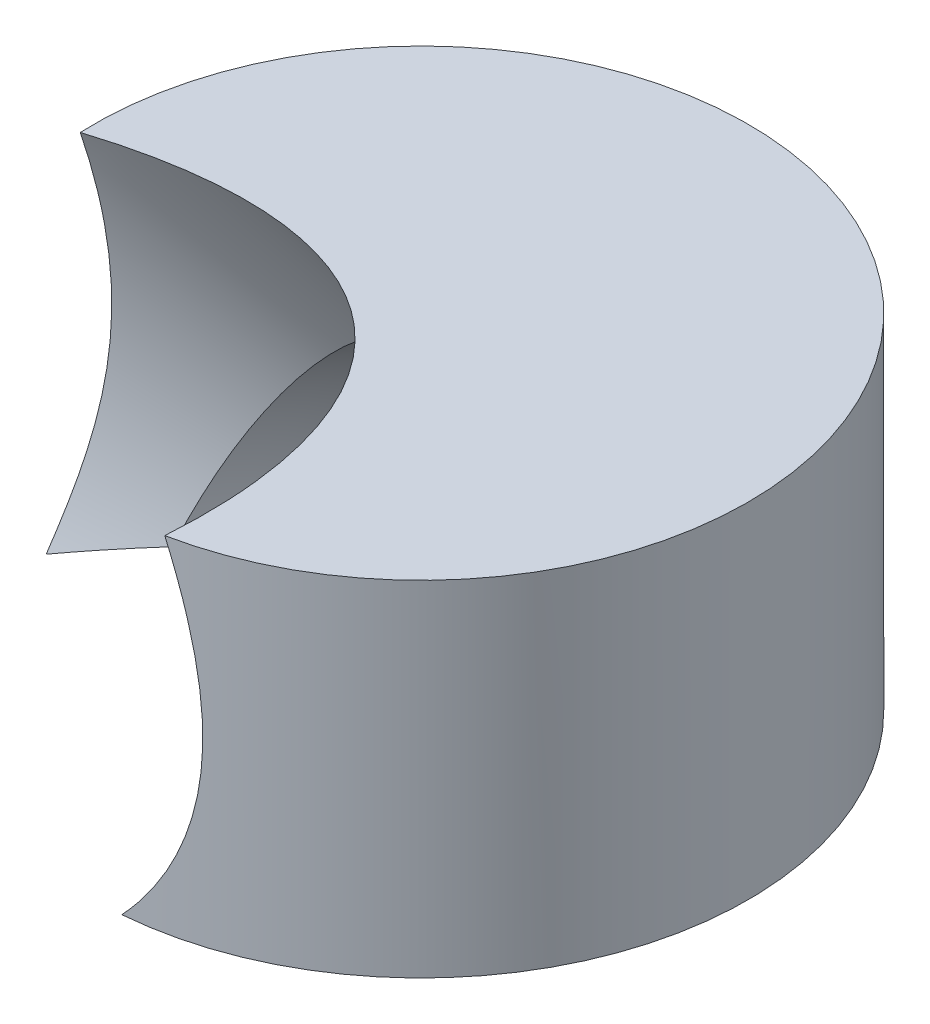
ISO-10303-21;
HEADER;
FILE_DESCRIPTION(('STEP AP214'),'2;1');
FILE_NAME('part.step','',(''),(''),'','','');
FILE_SCHEMA(('AUTOMOTIVE_DESIGN { 1 0 10303 214 1 1 1 1 }'));
ENDSEC;
DATA;
#1=APPLICATION_CONTEXT('core data for automotive mechanical design processes');
#2=APPLICATION_PROTOCOL_DEFINITION('international standard','automotive_design',2000,#1);
#3=PRODUCT_CONTEXT('',#1,'mechanical');
#4=PRODUCT('Part','Part','',(#3));
#5=PRODUCT_RELATED_PRODUCT_CATEGORY('part','',(#4));
#6=PRODUCT_DEFINITION_FORMATION('','',#4);
#7=PRODUCT_DEFINITION_CONTEXT('part definition',#1,'design');
#8=PRODUCT_DEFINITION('design','',#6,#7);
#9=PRODUCT_DEFINITION_SHAPE('','',#8);
#10=(LENGTH_UNIT() NAMED_UNIT(*) SI_UNIT(.MILLI.,.METRE.));
#11=(NAMED_UNIT(*) PLANE_ANGLE_UNIT() SI_UNIT($,.RADIAN.));
#12=(NAMED_UNIT(*) SI_UNIT($,.STERADIAN.) SOLID_ANGLE_UNIT());
#13=UNCERTAINTY_MEASURE_WITH_UNIT(LENGTH_MEASURE(1.E-05),#10,'distance_accuracy_value','');
#14=(GEOMETRIC_REPRESENTATION_CONTEXT(3) GLOBAL_UNCERTAINTY_ASSIGNED_CONTEXT((#13)) GLOBAL_UNIT_ASSIGNED_CONTEXT((#10,
#11,#12)) REPRESENTATION_CONTEXT('',''));
#15=CARTESIAN_POINT('',(0.,0.,0.));
#16=DIRECTION('',(0.,0.,1.));
#17=DIRECTION('',(1.,0.,0.));
#18=AXIS2_PLACEMENT_3D('',#15,#16,#17);
#19=CARTESIAN_POINT('',(-30.3108891324554,-97.7,-15.));
#20=DIRECTION('',(0.,1.,0.));
#21=DIRECTION('',(0.,0.,1.));
#22=AXIS2_PLACEMENT_3D('',#19,#20,#21);
#23=CYLINDRICAL_SURFACE('',#22,3.8);
#24=CARTESIAN_POINT('',(-30.3108891324554,-97.,-15.));
#25=DIRECTION('',(0.,-1.,0.));
#26=DIRECTION('',(0.,0.,-1.));
#27=AXIS2_PLACEMENT_3D('',#24,#25,#26);
#28=CIRCLE('',#27,3.8);
#29=CARTESIAN_POINT('',(-34.1074748867385,-97.,-14.8389515278731));
#30=VERTEX_POINT('',#29);
#31=CARTESIAN_POINT('',(-29.5615041608978,-97.,-11.2746245606109));
#32=VERTEX_POINT('',#31);
#33=EDGE_CURVE('E47',#30,#32,#28,.T.);
#34=ORIENTED_EDGE('',*,*,#33,.T.);
#35=CARTESIAN_POINT('',(-29.5615718217302,-96.9998,-11.2746109508069));
#36=CARTESIAN_POINT('',(-29.53763803957,-97.0705546747354,-11.2794247462016));
#37=CARTESIAN_POINT('',(-29.5146500801677,-97.1416227927385,-11.2842887533409));
#38=CARTESIAN_POINT('',(-29.4706900194513,-97.2843968994103,-11.2939816546816));
#39=CARTESIAN_POINT('',(-29.4497183150889,-97.3561030106608,-11.2988105417965));
#40=CARTESIAN_POINT('',(-29.3898726378823,-97.5727136817751,-11.3130751591436));
#41=CARTESIAN_POINT('',(-29.3542565706601,-97.7185595063866,-11.3222492231308));
#42=CARTESIAN_POINT('',(-29.2925498799048,-98.0158920594205,-11.3388484808279));
#43=CARTESIAN_POINT('',(-29.2666970753927,-98.1674313864205,-11.3462286182644));
#44=CARTESIAN_POINT('',(-29.2281326277631,-98.4721704684842,-11.3574647994605));
#45=CARTESIAN_POINT('',(-29.2153985650956,-98.6253669371334,-11.361326854209));
#46=CARTESIAN_POINT('',(-29.2081906977153,-98.8659999089151,-11.3635109048227));
#47=CARTESIAN_POINT('',(-29.2082058948879,-98.9532633070037,-11.3635051651497));
#48=CARTESIAN_POINT('',(-29.2141562776908,-99.1275942839115,-11.3617048818101));
#49=CARTESIAN_POINT('',(-29.2200916228646,-99.21466185739,-11.3599102899354));
#50=CARTESIAN_POINT('',(-29.2384728837583,-99.3874862827804,-11.3544527278158));
#51=CARTESIAN_POINT('',(-29.25087590459,-99.473247984399,-11.350802071296));
#52=CARTESIAN_POINT('',(-29.28271386022,-99.6433678720104,-11.341703913024));
#53=CARTESIAN_POINT('',(-29.3021482085004,-99.7277261744541,-11.3362565611463));
#54=CARTESIAN_POINT('',(-29.3486730087821,-99.8952399752276,-11.3237619418322));
#55=CARTESIAN_POINT('',(-29.3758484243732,-99.9783707074235,-11.3166971003957));
#56=CARTESIAN_POINT('',(-29.4378599705625,-100.141642311545,-11.30150885241));
#57=CARTESIAN_POINT('',(-29.4726971532893,-100.22178277107,-11.2933853005391));
#58=CARTESIAN_POINT('',(-29.5498590103042,-100.378437216735,-11.276776971286));
#59=CARTESIAN_POINT('',(-29.5921916387963,-100.454947239775,-11.268291817506));
#60=CARTESIAN_POINT('',(-29.6838301804554,-100.603678553575,-11.2518058035735));
#61=CARTESIAN_POINT('',(-29.7331327845388,-100.675901856539,-11.2438047161636));
#62=CARTESIAN_POINT('',(-29.8188734097495,-100.790159616009,-11.2318373349568));
#63=CARTESIAN_POINT('',(-29.8534280990566,-100.83358075225,-11.2274651122902));
#64=CARTESIAN_POINT('',(-29.9247889301809,-100.918387540099,-11.2194954705612));
#65=CARTESIAN_POINT('',(-29.9615881491862,-100.959778804244,-11.2158958098834));
#66=CARTESIAN_POINT('',(-29.999468369808,-101.0002,-11.2127824054338));
#67=B_SPLINE_CURVE_WITH_KNOTS('',3,(#35,#36,#37,#38,#39,#40,#41,#42,#43,#44,#45,#46,#47,#48,#49,
#50,#51,#52,#53,#54,#55,#56,#57,#58,#59,#60,#61,#62,#63,#64,#65,#66),.UNSPECIFIED.,.F.,.F.,(4,2,
2,2,2,2,2,2,2,2,2,2,2,2,2,4),(0.,0.224529608607515,0.449103331512431,0.899999438099035,
1.36126182999433,1.82173462355426,2.08334352968175,2.34495948616094,2.60486201655758,
2.86474287218575,3.12759392537997,3.39048109634734,3.65364893503421,3.91669224847533,
4.08360469898824,4.25002609611653),.UNSPECIFIED.);
#68=CARTESIAN_POINT('',(-29.9992809717437,-101.,-11.2127978197385));
#69=VERTEX_POINT('',#68);
#70=EDGE_CURVE('E65',#32,#69,#67,.T.);
#71=ORIENTED_EDGE('',*,*,#70,.T.);
#72=CARTESIAN_POINT('',(-30.3108891324554,-101.,-15.));
#73=DIRECTION('',(0.,-1.,0.));
#74=DIRECTION('',(0.,0.,-1.));
#75=AXIS2_PLACEMENT_3D('',#72,#73,#74);
#76=CIRCLE('',#75,3.8);
#77=CARTESIAN_POINT('',(-34.0630722359518,-101.,-14.3990657624698));
#78=VERTEX_POINT('',#77);
#79=EDGE_CURVE('E85',#78,#69,#76,.T.);
#80=ORIENTED_EDGE('',*,*,#79,.F.);
#81=CARTESIAN_POINT('',(-34.0630424960343,-101.0002,-14.3988800983306));
#82=CARTESIAN_POINT('',(-34.0718110950236,-100.941314470494,-14.4535727451348));
#83=CARTESIAN_POINT('',(-34.0790221760432,-100.880334472737,-14.5062811678693));
#84=CARTESIAN_POINT('',(-34.0908557219644,-100.754374278326,-14.6070441904282));
#85=CARTESIAN_POINT('',(-34.0954772635486,-100.689392664025,-14.655097125263));
#86=CARTESIAN_POINT('',(-34.1026321593722,-100.556042110918,-14.7455647480082));
#87=CARTESIAN_POINT('',(-34.1051772884519,-100.487694636403,-14.7880100685159));
#88=CARTESIAN_POINT('',(-34.1087664887118,-100.347645833791,-14.8669930394829));
#89=CARTESIAN_POINT('',(-34.1098108736453,-100.275945209957,-14.9035319233538));
#90=CARTESIAN_POINT('',(-34.1109217529916,-100.129422236479,-14.970402087824));
#91=CARTESIAN_POINT('',(-34.1109851278273,-100.054590686642,-15.0007132631708));
#92=CARTESIAN_POINT('',(-34.1105903971042,-99.9025749564758,-15.0547990580072));
#93=CARTESIAN_POINT('',(-34.1101320842451,-99.8253898527917,-15.0785710744027));
#94=CARTESIAN_POINT('',(-34.1090618616021,-99.6693551529714,-15.1196080622126));
#95=CARTESIAN_POINT('',(-34.1084500210118,-99.5905063212864,-15.1368759562337));
#96=CARTESIAN_POINT('',(-34.1073225352008,-99.4316928256814,-15.1652013652592));
#97=CARTESIAN_POINT('',(-34.1068069187919,-99.3517278352348,-15.1762570221539));
#98=CARTESIAN_POINT('',(-34.105844151858,-99.1563821489884,-15.1961271026659));
#99=CARTESIAN_POINT('',(-34.105523751255,-99.0406874090679,-15.2018883521968));
#100=CARTESIAN_POINT('',(-34.1054574020448,-98.8092431130936,-15.2030801746675));
#101=CARTESIAN_POINT('',(-34.1057117891474,-98.6934935645024,-15.1985047103584));
#102=CARTESIAN_POINT('',(-34.1066077120446,-98.4621048722978,-15.180551636075));
#103=CARTESIAN_POINT('',(-34.1072512583088,-98.3464694469417,-15.1671282836051));
#104=CARTESIAN_POINT('',(-34.1086049493334,-98.1163673648676,-15.1328387347087));
#105=CARTESIAN_POINT('',(-34.109315079109,-98.001900451573,-15.1119742099853));
#106=CARTESIAN_POINT('',(-34.1106104820581,-97.7367003729433,-15.0560139292456));
#107=CARTESIAN_POINT('',(-34.1110770227965,-97.5864778116717,-15.0184938633948));
#108=CARTESIAN_POINT('',(-34.1106868548476,-97.3639688517672,-14.9556101110743));
#109=CARTESIAN_POINT('',(-34.1103798808479,-97.2906762454686,-14.9336903207714));
#110=CARTESIAN_POINT('',(-34.1093014387462,-97.14474722216,-14.8877902799355));
#111=CARTESIAN_POINT('',(-34.1085300015538,-97.0721107618106,-14.8638101666064));
#112=CARTESIAN_POINT('',(-34.1074719611309,-96.9998,-14.8388825738608));
#113=B_SPLINE_CURVE_WITH_KNOTS('',3,(#81,#82,#83,#84,#85,#86,#87,#88,#89,#90,#91,#92,#93,#94,
#95,#96,#97,#98,#99,#100,#101,#102,#103,#104,#105,#106,#107,#108,#109,#110,#111,#112),
.UNSPECIFIED.,.F.,.F.,(4,2,2,2,2,2,2,2,2,2,2,2,2,2,2,4),(0.,0.242487812446074,0.485062030598367,
0.726250914982039,0.967389367841488,1.20929447541561,1.45129574114893,1.69318813428323,
1.93515284012405,2.28209096716264,2.62923177885386,2.97818149210641,3.32705286107753,
3.79116730720975,4.020646080706,4.25010958426821),.UNSPECIFIED.);
#114=EDGE_CURVE('E100',#78,#30,#113,.T.);
#115=ORIENTED_EDGE('',*,*,#114,.T.);
#116=EDGE_LOOP('',(#34,#71,#80,#115));
#117=FACE_BOUND('',#116,.T.);
#118=ADVANCED_FACE('F41',(#117),#23,.T.);
#119=CARTESIAN_POINT('',(-30.3108891324554,-97.,-15.));
#120=DIRECTION('',(0.,-1.,0.));
#121=DIRECTION('',(0.,0.,-1.));
#122=AXIS2_PLACEMENT_3D('',#119,#120,#121);
#123=PLANE('',#122);
#124=ORIENTED_EDGE('',*,*,#33,.F.);
#125=CARTESIAN_POINT('',(-37.139132571092,-97.,-6.29120446410718));
#126=DIRECTION('',(0.,-1.,0.));
#127=DIRECTION('',(-0.617017715423195,0.,0.786949260660394));
#128=AXIS2_PLACEMENT_3D('',#125,#126,#127);
#129=ELLIPSE('',#128,10.5033012386468,5.02786274995613);
#130=EDGE_CURVE('E84',#30,#32,#129,.T.);
#131=ORIENTED_EDGE('',*,*,#130,.T.);
#132=EDGE_LOOP('',(#124,#131));
#133=FACE_BOUND('',#132,.T.);
#134=ADVANCED_FACE('F108',(#133),#123,.F.);
#135=CARTESIAN_POINT('',(-30.3108891324554,-101.,-15.));
#136=DIRECTION('',(0.,-1.,0.));
#137=DIRECTION('',(0.,0.,-1.));
#138=AXIS2_PLACEMENT_3D('',#135,#136,#137);
#139=PLANE('',#138);
#140=CARTESIAN_POINT('',(-31.835817099933,-101.,-13.0550948431946));
#141=DIRECTION('',(0.,-1.,0.));
#142=DIRECTION('',(-0.617017715423195,0.,0.786949260660394));
#143=AXIS2_PLACEMENT_3D('',#140,#141,#142);
#144=ELLIPSE('',#143,5.40311255334571,2.58643522865266);
#145=CARTESIAN_POINT('',(-33.4038431098608,-101.,-15.2088915834869));
#146=VERTEX_POINT('',#145);
#147=EDGE_CURVE('E57',#78,#146,#144,.T.);
#148=ORIENTED_EDGE('',*,*,#147,.F.);
#149=ORIENTED_EDGE('',*,*,#79,.T.);
#150=CARTESIAN_POINT('',(-29.3701180218789,-101.,-12.0461974139248));
#151=VERTEX_POINT('',#150);
#152=EDGE_CURVE('E71',#151,#69,#144,.T.);
#153=ORIENTED_EDGE('',*,*,#152,.F.);
#154=CARTESIAN_POINT('',(-30.3108891324554,-101.,-15.));
#155=DIRECTION('',(0.,-1.,0.));
#156=DIRECTION('',(0.,0.,-1.));
#157=AXIS2_PLACEMENT_3D('',#154,#155,#156);
#158=CIRCLE('',#157,3.1);
#159=EDGE_CURVE('E79',#146,#151,#158,.T.);
#160=ORIENTED_EDGE('',*,*,#159,.F.);
#161=EDGE_LOOP('',(#148,#149,#153,#160));
#162=FACE_BOUND('',#161,.T.);
#163=ADVANCED_FACE('F77',(#162),#139,.T.);
#164=CARTESIAN_POINT('',(-30.3108891324554,-101.,-15.));
#165=DIRECTION('',(0.,0.,-1.));
#166=DIRECTION('',(-1.,0.,0.));
#167=AXIS2_PLACEMENT_3D('',#164,#165,#166);
#168=SPHERICAL_SURFACE('',#167,3.1);
#169=ORIENTED_EDGE('',*,*,#159,.T.);
#170=CARTESIAN_POINT('',(-31.0751548694972,-100.208810505388,-14.0252494512242));
#171=DIRECTION('',(0.51999029893439,-0.538308656109163,-0.663199728416765));
#172=DIRECTION('',(0.,0.776423951617283,-0.630210954645349));
#173=AXIS2_PLACEMENT_3D('',#170,#171,#172);
#174=CIRCLE('',#173,2.72942822482296);
#175=EDGE_CURVE('E11',#151,#146,#174,.F.);
#176=ORIENTED_EDGE('',*,*,#175,.T.);
#177=EDGE_LOOP('',(#169,#176));
#178=FACE_BOUND('',#177,.T.);
#179=ADVANCED_FACE('F82',(#178),#168,.F.);
#180=CARTESIAN_POINT('',(-30.3108891324553,-101.,-15.));
#181=DIRECTION('',(-0.51999029893439,0.538308656109163,0.663199728416765));
#182=DIRECTION('',(0.,-0.776423951617283,0.630210954645349));
#183=AXIS2_PLACEMENT_3D('',#180,#181,#182);
#184=CONICAL_SURFACE('',#183,2.29999999999998,0.284261523704203);
#185=ORIENTED_EDGE('',*,*,#114,.F.);
#186=ORIENTED_EDGE('',*,*,#147,.T.);
#187=ORIENTED_EDGE('',*,*,#175,.F.);
#188=ORIENTED_EDGE('',*,*,#152,.T.);
#189=ORIENTED_EDGE('',*,*,#70,.F.);
#190=ORIENTED_EDGE('',*,*,#130,.F.);
#191=EDGE_LOOP('',(#185,#186,#187,#188,#189,#190));
#192=FACE_BOUND('',#191,.T.);
#193=ADVANCED_FACE('F75',(#192),#184,.F.);
#194=CLOSED_SHELL('',(#118,#134,#163,#179,#193));
#195=MANIFOLD_SOLID_BREP('B2',#194);
#196=ADVANCED_BREP_SHAPE_REPRESENTATION('',(#18,#195),#14);
#197=SHAPE_DEFINITION_REPRESENTATION(#9,#196);
ENDSEC;
END-ISO-10303-21;
